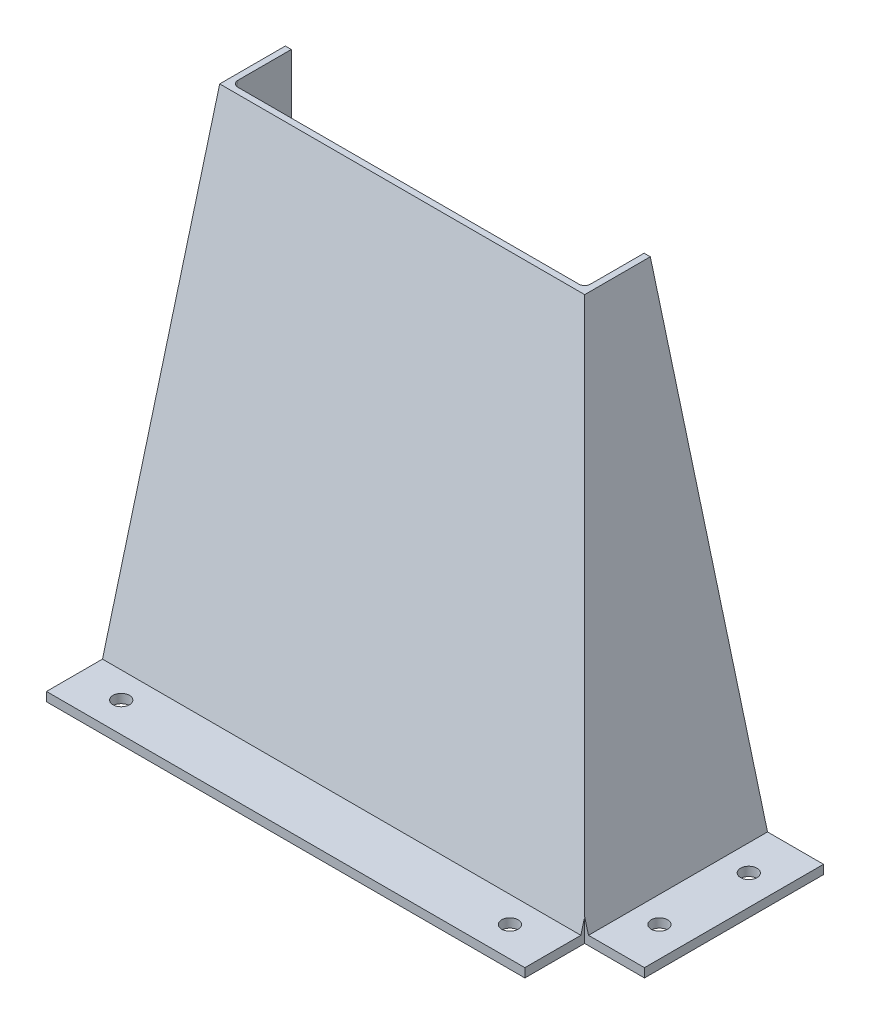
ISO-10303-21;
HEADER;
FILE_DESCRIPTION(('STEP AP214'),'2;1');
FILE_NAME('part.step','',(''),(''),'','','');
FILE_SCHEMA(('AUTOMOTIVE_DESIGN { 1 0 10303 214 1 1 1 1 }'));
ENDSEC;
DATA;
#1=APPLICATION_CONTEXT('core data for automotive mechanical design processes');
#2=APPLICATION_PROTOCOL_DEFINITION('international standard','automotive_design',2000,#1);
#3=PRODUCT_CONTEXT('',#1,'mechanical');
#4=PRODUCT('Part','Part','',(#3));
#5=PRODUCT_RELATED_PRODUCT_CATEGORY('part','',(#4));
#6=PRODUCT_DEFINITION_FORMATION('','',#4);
#7=PRODUCT_DEFINITION_CONTEXT('part definition',#1,'design');
#8=PRODUCT_DEFINITION('design','',#6,#7);
#9=PRODUCT_DEFINITION_SHAPE('','',#8);
#10=(LENGTH_UNIT() NAMED_UNIT(*) SI_UNIT(.MILLI.,.METRE.));
#11=(NAMED_UNIT(*) PLANE_ANGLE_UNIT() SI_UNIT($,.RADIAN.));
#12=(NAMED_UNIT(*) SI_UNIT($,.STERADIAN.) SOLID_ANGLE_UNIT());
#13=UNCERTAINTY_MEASURE_WITH_UNIT(LENGTH_MEASURE(1.E-05),#10,'distance_accuracy_value','');
#14=(GEOMETRIC_REPRESENTATION_CONTEXT(3) GLOBAL_UNCERTAINTY_ASSIGNED_CONTEXT((#13)) GLOBAL_UNIT_ASSIGNED_CONTEXT((#10,
#11,#12)) REPRESENTATION_CONTEXT('',''));
#15=CARTESIAN_POINT('',(0.,0.,0.));
#16=DIRECTION('',(0.,0.,1.));
#17=DIRECTION('',(1.,0.,0.));
#18=AXIS2_PLACEMENT_3D('',#15,#16,#17);
#19=CARTESIAN_POINT('',(0.,0.,0.));
#20=DIRECTION('',(0.,1.,0.));
#21=DIRECTION('',(0.,0.,1.));
#22=AXIS2_PLACEMENT_3D('',#19,#20,#21);
#23=PLANE('',#22);
#24=CARTESIAN_POINT('',(87.9651100404987,0.,-15.975));
#25=DIRECTION('',(0.,-1.,0.));
#26=DIRECTION('',(0.,0.,-1.));
#27=AXIS2_PLACEMENT_3D('',#24,#25,#26);
#28=CIRCLE('',#27,2.75000000000001);
#29=CARTESIAN_POINT('',(87.9651100404987,0.,-18.725));
#30=VERTEX_POINT('',#29);
#31=EDGE_CURVE('E216',#30,#30,#28,.T.);
#32=ORIENTED_EDGE('',*,*,#31,.F.);
#33=EDGE_LOOP('',(#32));
#34=FACE_BOUND('',#33,.T.);
#35=CARTESIAN_POINT('',(87.9651100404987,0.,13.9051100404987));
#36=DIRECTION('',(0.,-1.,0.));
#37=DIRECTION('',(0.,0.,-1.));
#38=AXIS2_PLACEMENT_3D('',#35,#36,#37);
#39=CIRCLE('',#38,2.75000000000001);
#40=CARTESIAN_POINT('',(87.9651100404987,0.,11.1551100404986));
#41=VERTEX_POINT('',#40);
#42=EDGE_CURVE('E398',#41,#41,#39,.T.);
#43=ORIENTED_EDGE('',*,*,#42,.F.);
#44=EDGE_LOOP('',(#43));
#45=FACE_BOUND('',#44,.T.);
#46=CARTESIAN_POINT('',(62.9651100404987,0.,38.9051100404986));
#47=DIRECTION('',(0.,-1.,0.));
#48=DIRECTION('',(0.,0.,-1.));
#49=AXIS2_PLACEMENT_3D('',#46,#47,#48);
#50=CIRCLE('',#49,2.75000000000001);
#51=CARTESIAN_POINT('',(62.9651100404987,0.,36.1551100404986));
#52=VERTEX_POINT('',#51);
#53=EDGE_CURVE('E402',#52,#52,#50,.T.);
#54=ORIENTED_EDGE('',*,*,#53,.F.);
#55=EDGE_LOOP('',(#54));
#56=FACE_BOUND('',#55,.T.);
#57=CARTESIAN_POINT('',(-67.035,0.,38.9051100404986));
#58=DIRECTION('',(0.,-1.,0.));
#59=DIRECTION('',(0.,0.,-1.));
#60=AXIS2_PLACEMENT_3D('',#57,#58,#59);
#61=CIRCLE('',#60,2.75000000000001);
#62=CARTESIAN_POINT('',(-67.035,0.,36.1551100404986));
#63=VERTEX_POINT('',#62);
#64=EDGE_CURVE('E405',#63,#63,#61,.T.);
#65=ORIENTED_EDGE('',*,*,#64,.F.);
#66=EDGE_LOOP('',(#65));
#67=FACE_BOUND('',#66,.T.);
#68=DIRECTION('',(0.,0.,1.));
#69=VECTOR('',#68,1.);
#70=CARTESIAN_POINT('',(-80.035,0.,28.9051100404986));
#71=LINE('',#70,#69);
#72=CARTESIAN_POINT('',(-80.035,0.,-30.975));
#73=VERTEX_POINT('',#72);
#74=CARTESIAN_POINT('',(-80.035,0.,26.8352200809973));
#75=VERTEX_POINT('',#74);
#76=EDGE_CURVE('E193',#73,#75,#71,.T.);
#77=ORIENTED_EDGE('',*,*,#76,.T.);
#78=CARTESIAN_POINT('',(-78.035,0.,26.8352200809973));
#79=DIRECTION('',(0.,1.,0.));
#80=DIRECTION('',(0.,0.,-1.));
#81=AXIS2_PLACEMENT_3D('',#78,#79,#80);
#82=ELLIPSE('',#81,2.06988995950134,2.);
#83=CARTESIAN_POINT('',(-78.035,0.,28.9051100404986));
#84=VERTEX_POINT('',#83);
#85=EDGE_CURVE('E14',#75,#84,#82,.T.);
#86=ORIENTED_EDGE('',*,*,#85,.T.);
#87=DIRECTION('',(1.,0.,0.));
#88=VECTOR('',#87,1.);
#89=CARTESIAN_POINT('',(0.,0.,28.9051100404986));
#90=LINE('',#89,#88);
#91=CARTESIAN_POINT('',(76.0326401612962,0.,28.9051100404986));
#92=VERTEX_POINT('',#91);
#93=EDGE_CURVE('E230',#84,#92,#90,.T.);
#94=ORIENTED_EDGE('',*,*,#93,.T.);
#95=CARTESIAN_POINT('',(75.8952200809973,0.,26.8352200809973));
#96=DIRECTION('',(0.,1.,0.));
#97=DIRECTION('',(-0.707106781186548,0.,-0.707106781186548));
#98=AXIS2_PLACEMENT_3D('',#95,#96,#97);
#99=ELLIPSE('',#98,2.13749593891752,2.);
#100=CARTESIAN_POINT('',(77.9651100404987,0.,26.9726401612961));
#101=VERTEX_POINT('',#100);
#102=EDGE_CURVE('E223',#92,#101,#99,.T.);
#103=ORIENTED_EDGE('',*,*,#102,.T.);
#104=DIRECTION('',(0.,0.,-1.));
#105=VECTOR('',#104,1.);
#106=CARTESIAN_POINT('',(77.9651100404987,0.,0.));
#107=LINE('',#106,#105);
#108=CARTESIAN_POINT('',(77.9651100404987,0.,-30.975));
#109=VERTEX_POINT('',#108);
#110=EDGE_CURVE('E71',#101,#109,#107,.T.);
#111=ORIENTED_EDGE('',*,*,#110,.T.);
#112=DIRECTION('',(-1.,0.,0.));
#113=VECTOR('',#112,1.);
#114=CARTESIAN_POINT('',(-80.035,0.,-30.975));
#115=LINE('',#114,#113);
#116=CARTESIAN_POINT('',(97.9651100404987,0.,-30.975));
#117=VERTEX_POINT('',#116);
#118=EDGE_CURVE('E267',#117,#109,#115,.T.);
#119=ORIENTED_EDGE('',*,*,#118,.F.);
#120=DIRECTION('',(0.,0.,-1.));
#121=VECTOR('',#120,1.);
#122=CARTESIAN_POINT('',(97.9651100404987,0.,69.1288584566553));
#123=LINE('',#122,#121);
#124=CARTESIAN_POINT('',(97.9651100404987,0.,28.9051100404986));
#125=VERTEX_POINT('',#124);
#126=EDGE_CURVE('E564',#125,#117,#123,.T.);
#127=ORIENTED_EDGE('',*,*,#126,.F.);
#128=DIRECTION('',(1.,0.,0.));
#129=VECTOR('',#128,1.);
#130=CARTESIAN_POINT('',(97.9651100404987,0.,28.9051100404987));
#131=LINE('',#130,#129);
#132=CARTESIAN_POINT('',(77.9651100404987,0.,28.9051100404986));
#133=VERTEX_POINT('',#132);
#134=EDGE_CURVE('E548',#133,#125,#131,.T.);
#135=ORIENTED_EDGE('',*,*,#134,.F.);
#136=DIRECTION('',(0.,0.,-1.));
#137=VECTOR('',#136,1.);
#138=CARTESIAN_POINT('',(77.9651100404987,0.,48.9051100404986));
#139=LINE('',#138,#137);
#140=CARTESIAN_POINT('',(77.9651100404987,0.,48.9051100404986));
#141=VERTEX_POINT('',#140);
#142=EDGE_CURVE('E545',#141,#133,#139,.T.);
#143=ORIENTED_EDGE('',*,*,#142,.F.);
#144=DIRECTION('',(-1.,0.,0.));
#145=VECTOR('',#144,1.);
#146=CARTESIAN_POINT('',(100.212107655599,0.,48.9051100404986));
#147=LINE('',#146,#145);
#148=CARTESIAN_POINT('',(-82.035,0.,48.9051100404986));
#149=VERTEX_POINT('',#148);
#150=EDGE_CURVE('E179',#141,#149,#147,.T.);
#151=ORIENTED_EDGE('',*,*,#150,.T.);
#152=DIRECTION('',(0.,0.,1.));
#153=VECTOR('',#152,1.);
#154=CARTESIAN_POINT('',(-82.035,0.,28.9051100404986));
#155=LINE('',#154,#153);
#156=CARTESIAN_POINT('',(-82.035,0.,-30.975));
#157=VERTEX_POINT('',#156);
#158=EDGE_CURVE('E192',#157,#149,#155,.T.);
#159=ORIENTED_EDGE('',*,*,#158,.F.);
#160=DIRECTION('',(1.,0.,0.));
#161=VECTOR('',#160,1.);
#162=CARTESIAN_POINT('',(-82.035,0.,-30.975));
#163=LINE('',#162,#161);
#164=EDGE_CURVE('E208',#157,#73,#163,.T.);
#165=ORIENTED_EDGE('',*,*,#164,.T.);
#166=EDGE_LOOP('',(#77,#86,#94,#103,#111,#119,#127,#135,#143,#151,#159,#165));
#167=FACE_BOUND('',#166,.T.);
#168=ADVANCED_FACE('F56',(#34,#45,#56,#67,#167),#23,.F.);
#169=CARTESIAN_POINT('',(100.212107655599,3.,28.9051100404986));
#170=DIRECTION('',(0.,1.,0.));
#171=DIRECTION('',(0.,0.,1.));
#172=AXIS2_PLACEMENT_3D('',#169,#170,#171);
#173=PLANE('',#172);
#174=CARTESIAN_POINT('',(62.9651100404987,3.,38.9051100404986));
#175=DIRECTION('',(0.,1.,0.));
#176=DIRECTION('',(0.,0.,1.));
#177=AXIS2_PLACEMENT_3D('',#174,#175,#176);
#178=CIRCLE('',#177,2.75000000000001);
#179=CARTESIAN_POINT('',(62.9651100404987,3.,41.6551100404987));
#180=VERTEX_POINT('',#179);
#181=EDGE_CURVE('E407',#180,#180,#178,.F.);
#182=ORIENTED_EDGE('',*,*,#181,.T.);
#183=EDGE_LOOP('',(#182));
#184=FACE_BOUND('',#183,.T.);
#185=CARTESIAN_POINT('',(-67.035,3.,38.9051100404986));
#186=DIRECTION('',(0.,1.,0.));
#187=DIRECTION('',(0.,0.,1.));
#188=AXIS2_PLACEMENT_3D('',#185,#186,#187);
#189=CIRCLE('',#188,2.75000000000001);
#190=CARTESIAN_POINT('',(-67.035,3.,41.6551100404987));
#191=VERTEX_POINT('',#190);
#192=EDGE_CURVE('E199',#191,#191,#189,.F.);
#193=ORIENTED_EDGE('',*,*,#192,.T.);
#194=EDGE_LOOP('',(#193));
#195=FACE_BOUND('',#194,.T.);
#196=DIRECTION('',(0.,0.,-1.));
#197=VECTOR('',#196,1.);
#198=CARTESIAN_POINT('',(77.9651100404987,3.,48.9051100404986));
#199=LINE('',#198,#197);
#200=CARTESIAN_POINT('',(77.9651100404987,3.,48.9051100404986));
#201=VERTEX_POINT('',#200);
#202=CARTESIAN_POINT('',(77.9651100404987,3.,30.175));
#203=VERTEX_POINT('',#202);
#204=EDGE_CURVE('E276',#201,#203,#199,.T.);
#205=ORIENTED_EDGE('',*,*,#204,.T.);
#206=DIRECTION('',(1.,0.,0.));
#207=VECTOR('',#206,1.);
#208=CARTESIAN_POINT('',(0.,3.,30.175));
#209=LINE('',#208,#207);
#210=CARTESIAN_POINT('',(-82.035,3.,30.175));
#211=VERTEX_POINT('',#210);
#212=EDGE_CURVE('E178',#211,#203,#209,.T.);
#213=ORIENTED_EDGE('',*,*,#212,.F.);
#214=DIRECTION('',(0.,0.,-1.));
#215=VECTOR('',#214,1.);
#216=CARTESIAN_POINT('',(-82.035,3.,48.9051100404986));
#217=LINE('',#216,#215);
#218=CARTESIAN_POINT('',(-82.035,3.,48.9051100404986));
#219=VERTEX_POINT('',#218);
#220=EDGE_CURVE('E182',#219,#211,#217,.T.);
#221=ORIENTED_EDGE('',*,*,#220,.F.);
#222=DIRECTION('',(-1.,0.,0.));
#223=VECTOR('',#222,1.);
#224=CARTESIAN_POINT('',(100.212107655599,3.,48.9051100404986));
#225=LINE('',#224,#223);
#226=EDGE_CURVE('E169',#201,#219,#225,.T.);
#227=ORIENTED_EDGE('',*,*,#226,.F.);
#228=EDGE_LOOP('',(#205,#213,#221,#227));
#229=FACE_BOUND('',#228,.T.);
#230=ADVANCED_FACE('F183',(#184,#195,#229),#173,.T.);
#231=CARTESIAN_POINT('',(0.,150.,0.));
#232=DIRECTION('',(0.,-1.,0.));
#233=DIRECTION('',(0.,0.,-1.));
#234=AXIS2_PLACEMENT_3D('',#231,#232,#233);
#235=PLANE('',#234);
#236=DIRECTION('',(1.,0.,0.));
#237=VECTOR('',#236,1.);
#238=CARTESIAN_POINT('',(0.,150.,-11.0948899595014));
#239=LINE('',#238,#237);
#240=CARTESIAN_POINT('',(-78.035,150.,-11.0948899595014));
#241=VERTEX_POINT('',#240);
#242=CARTESIAN_POINT('',(36.0326401612962,150.,-11.0948899595014));
#243=VERTEX_POINT('',#242);
#244=EDGE_CURVE('E250',#241,#243,#239,.T.);
#245=ORIENTED_EDGE('',*,*,#244,.F.);
#246=CARTESIAN_POINT('',(-78.035,150.,-13.1647799190027));
#247=DIRECTION('',(0.,-1.,0.));
#248=DIRECTION('',(0.,0.,-1.));
#249=AXIS2_PLACEMENT_3D('',#246,#247,#248);
#250=ELLIPSE('',#249,2.06988995950134,2.);
#251=CARTESIAN_POINT('',(-80.035,150.,-13.1647799190027));
#252=VERTEX_POINT('',#251);
#253=EDGE_CURVE('E64',#241,#252,#250,.T.);
#254=ORIENTED_EDGE('',*,*,#253,.T.);
#255=DIRECTION('',(0.,0.,-1.));
#256=VECTOR('',#255,1.);
#257=CARTESIAN_POINT('',(-80.035,150.,-30.975));
#258=LINE('',#257,#256);
#259=CARTESIAN_POINT('',(-80.035,150.,-30.975));
#260=VERTEX_POINT('',#259);
#261=EDGE_CURVE('E213',#252,#260,#258,.T.);
#262=ORIENTED_EDGE('',*,*,#261,.T.);
#263=DIRECTION('',(1.,0.,0.));
#264=VECTOR('',#263,1.);
#265=CARTESIAN_POINT('',(-82.035,150.,-30.975));
#266=LINE('',#265,#264);
#267=CARTESIAN_POINT('',(-82.035,150.,-30.975));
#268=VERTEX_POINT('',#267);
#269=EDGE_CURVE('E277',#268,#260,#266,.T.);
#270=ORIENTED_EDGE('',*,*,#269,.F.);
#271=DIRECTION('',(0.,0.,-1.));
#272=VECTOR('',#271,1.);
#273=CARTESIAN_POINT('',(-82.035,150.,-9.02500000000001));
#274=LINE('',#273,#272);
#275=CARTESIAN_POINT('',(-82.035,150.,-9.02500000000001));
#276=VERTEX_POINT('',#275);
#277=EDGE_CURVE('E203',#276,#268,#274,.T.);
#278=ORIENTED_EDGE('',*,*,#277,.F.);
#279=DIRECTION('',(1.,0.,0.));
#280=VECTOR('',#279,1.);
#281=CARTESIAN_POINT('',(-82.035,150.,-9.02500000000001));
#282=LINE('',#281,#280);
#283=CARTESIAN_POINT('',(-80.035,150.,-9.02500000000001));
#284=VERTEX_POINT('',#283);
#285=EDGE_CURVE('E274',#276,#284,#282,.T.);
#286=ORIENTED_EDGE('',*,*,#285,.T.);
#287=DIRECTION('',(1.,0.,0.));
#288=VECTOR('',#287,1.);
#289=CARTESIAN_POINT('',(-80.035,150.,-9.02500000000001));
#290=LINE('',#289,#288);
#291=CARTESIAN_POINT('',(40.035,150.,-9.02500000000001));
#292=VERTEX_POINT('',#291);
#293=EDGE_CURVE('E263',#284,#292,#290,.T.);
#294=ORIENTED_EDGE('',*,*,#293,.T.);
#295=DIRECTION('',(0.,0.,1.));
#296=VECTOR('',#295,1.);
#297=CARTESIAN_POINT('',(40.035,150.,-30.975));
#298=LINE('',#297,#296);
#299=CARTESIAN_POINT('',(40.035,150.,-30.975));
#300=VERTEX_POINT('',#299);
#301=EDGE_CURVE('E241',#300,#292,#298,.T.);
#302=ORIENTED_EDGE('',*,*,#301,.F.);
#303=DIRECTION('',(1.,0.,0.));
#304=VECTOR('',#303,1.);
#305=CARTESIAN_POINT('',(-80.035,150.,-30.975));
#306=LINE('',#305,#304);
#307=CARTESIAN_POINT('',(37.9651100404987,150.,-30.975));
#308=VERTEX_POINT('',#307);
#309=EDGE_CURVE('E237',#308,#300,#306,.T.);
#310=ORIENTED_EDGE('',*,*,#309,.F.);
#311=DIRECTION('',(0.,0.,1.));
#312=VECTOR('',#311,1.);
#313=CARTESIAN_POINT('',(37.9651100404987,150.,0.));
#314=LINE('',#313,#312);
#315=CARTESIAN_POINT('',(37.9651100404987,150.,-13.0273598387038));
#316=VERTEX_POINT('',#315);
#317=EDGE_CURVE('E270',#308,#316,#314,.T.);
#318=ORIENTED_EDGE('',*,*,#317,.T.);
#319=CARTESIAN_POINT('',(35.8952200809973,150.,-13.1647799190027));
#320=DIRECTION('',(0.,-1.,0.));
#321=DIRECTION('',(-0.707106781186548,0.,-0.707106781186548));
#322=AXIS2_PLACEMENT_3D('',#319,#320,#321);
#323=ELLIPSE('',#322,2.13749593891752,2.);
#324=EDGE_CURVE('E221',#316,#243,#323,.T.);
#325=ORIENTED_EDGE('',*,*,#324,.T.);
#326=EDGE_LOOP('',(#245,#254,#262,#270,#278,#286,#294,#302,#310,#318,#325));
#327=FACE_BOUND('',#326,.T.);
#328=ADVANCED_FACE('F291',(#327),#235,.F.);
#329=CARTESIAN_POINT('',(0.,0.,-30.975));
#330=DIRECTION('',(0.,0.,-1.));
#331=DIRECTION('',(-1.,0.,0.));
#332=AXIS2_PLACEMENT_3D('',#329,#330,#331);
#333=PLANE('',#332);
#334=DIRECTION('',(-0.257662650560332,0.966234939601246,0.));
#335=VECTOR('',#334,1.);
#336=CARTESIAN_POINT('',(80.035,0.,-30.975));
#337=LINE('',#336,#335);
#338=CARTESIAN_POINT('',(79.235,3.,-30.975));
#339=VERTEX_POINT('',#338);
#340=EDGE_CURVE('E261',#339,#300,#337,.T.);
#341=ORIENTED_EDGE('',*,*,#340,.F.);
#342=DIRECTION('',(1.,0.,0.));
#343=VECTOR('',#342,1.);
#344=CARTESIAN_POINT('',(77.9651100404987,3.,-30.975));
#345=LINE('',#344,#343);
#346=CARTESIAN_POINT('',(97.9651100404987,3.,-30.975));
#347=VERTEX_POINT('',#346);
#348=EDGE_CURVE('E558',#339,#347,#345,.T.);
#349=ORIENTED_EDGE('',*,*,#348,.T.);
#350=DIRECTION('',(0.,-1.,0.));
#351=VECTOR('',#350,1.);
#352=CARTESIAN_POINT('',(97.9651100404987,0.,-30.975));
#353=LINE('',#352,#351);
#354=EDGE_CURVE('E559',#347,#117,#353,.T.);
#355=ORIENTED_EDGE('',*,*,#354,.T.);
#356=ORIENTED_EDGE('',*,*,#118,.T.);
#357=DIRECTION('',(-0.257662650560332,0.966234939601246,0.));
#358=VECTOR('',#357,1.);
#359=CARTESIAN_POINT('',(72.7890031498432,19.4104008399582,-30.975));
#360=LINE('',#359,#358);
#361=EDGE_CURVE('E249',#109,#308,#360,.T.);
#362=ORIENTED_EDGE('',*,*,#361,.T.);
#363=ORIENTED_EDGE('',*,*,#309,.T.);
#364=EDGE_LOOP('',(#341,#349,#355,#356,#362,#363));
#365=FACE_BOUND('',#364,.T.);
#366=ADVANCED_FACE('F300',(#365),#333,.T.);
#367=CARTESIAN_POINT('',(0.,7.71161825726141,28.9185684647303));
#368=DIRECTION('',(0.,-0.257662650560332,-0.966234939601246));
#369=DIRECTION('',(0.,0.966234939601246,-0.257662650560332));
#370=AXIS2_PLACEMENT_3D('',#367,#368,#369);
#371=PLANE('',#370);
#372=ORIENTED_EDGE('',*,*,#212,.T.);
#373=DIRECTION('',(0.,-0.966234939601246,0.257662650560332));
#374=VECTOR('',#373,1.);
#375=CARTESIAN_POINT('',(77.9651100404987,135.578592935976,-5.1792914495935));
#376=LINE('',#375,#374);
#377=CARTESIAN_POINT('',(77.9651100404987,7.76208734813003,28.9051100404987));
#378=VERTEX_POINT('',#377);
#379=EDGE_CURVE('E553',#378,#203,#376,.T.);
#380=ORIENTED_EDGE('',*,*,#379,.F.);
#381=DIRECTION('',(-0.249513144620722,0.935674292327708,-0.249513144620722));
#382=VECTOR('',#381,1.);
#383=CARTESIAN_POINT('',(80.035,0.,30.975));
#384=LINE('',#383,#382);
#385=EDGE_CURVE('E264',#378,#292,#384,.T.);
#386=ORIENTED_EDGE('',*,*,#385,.T.);
#387=ORIENTED_EDGE('',*,*,#293,.F.);
#388=ORIENTED_EDGE('',*,*,#285,.F.);
#389=DIRECTION('',(0.,0.966234939601246,-0.257662650560332));
#390=VECTOR('',#389,1.);
#391=CARTESIAN_POINT('',(-82.035,3.,30.175));
#392=LINE('',#391,#390);
#393=EDGE_CURVE('E187',#211,#276,#392,.T.);
#394=ORIENTED_EDGE('',*,*,#393,.F.);
#395=EDGE_LOOP('',(#372,#380,#386,#387,#388,#394));
#396=FACE_BOUND('',#395,.T.);
#397=ADVANCED_FACE('F326',(#396),#371,.F.);
#398=CARTESIAN_POINT('',(74.7214730290457,19.9257261410788,0.));
#399=DIRECTION('',(0.966234939601246,0.257662650560332,0.));
#400=DIRECTION('',(-0.257662650560332,0.966234939601246,0.));
#401=AXIS2_PLACEMENT_3D('',#398,#399,#400);
#402=PLANE('',#401);
#403=DIRECTION('',(0.257662650560332,-0.966234939601246,0.));
#404=VECTOR('',#403,1.);
#405=CARTESIAN_POINT('',(43.8807085504065,135.578592935976,28.9051100404986));
#406=LINE('',#405,#404);
#407=CARTESIAN_POINT('',(79.235,3.,28.9051100404987));
#408=VERTEX_POINT('',#407);
#409=EDGE_CURVE('E542',#378,#408,#406,.T.);
#410=ORIENTED_EDGE('',*,*,#409,.T.);
#411=DIRECTION('',(0.,0.,1.));
#412=VECTOR('',#411,1.);
#413=CARTESIAN_POINT('',(79.235,3.,0.));
#414=LINE('',#413,#412);
#415=EDGE_CURVE('E566',#339,#408,#414,.T.);
#416=ORIENTED_EDGE('',*,*,#415,.F.);
#417=ORIENTED_EDGE('',*,*,#340,.T.);
#418=ORIENTED_EDGE('',*,*,#301,.T.);
#419=ORIENTED_EDGE('',*,*,#385,.F.);
#420=EDGE_LOOP('',(#410,#416,#417,#418,#419));
#421=FACE_BOUND('',#420,.T.);
#422=ADVANCED_FACE('F343',(#421),#402,.T.);
#423=CARTESIAN_POINT('',(0.,7.19629295614074,26.9860985855278));
#424=DIRECTION('',(0.,-0.257662650560332,-0.966234939601246));
#425=DIRECTION('',(0.,0.966234939601246,-0.257662650560332));
#426=AXIS2_PLACEMENT_3D('',#423,#424,#425);
#427=PLANE('',#426);
#428=ORIENTED_EDGE('',*,*,#244,.T.);
#429=DIRECTION('',(-0.249513144620722,0.935674292327708,-0.249513144620722));
#430=VECTOR('',#429,1.);
#431=CARTESIAN_POINT('',(69.4995506545697,24.4990856502245,22.3720205337721));
#432=LINE('',#431,#430);
#433=EDGE_CURVE('E217',#243,#92,#432,.F.);
#434=ORIENTED_EDGE('',*,*,#433,.T.);
#435=ORIENTED_EDGE('',*,*,#93,.F.);
#436=DIRECTION('',(0.,0.966234939601246,-0.257662650560332));
#437=VECTOR('',#436,1.);
#438=CARTESIAN_POINT('',(-78.035,7.19629295614074,26.9860985855278));
#439=LINE('',#438,#437);
#440=EDGE_CURVE('E236',#84,#241,#439,.T.);
#441=ORIENTED_EDGE('',*,*,#440,.T.);
#442=EDGE_LOOP('',(#428,#434,#435,#441));
#443=FACE_BOUND('',#442,.T.);
#444=ADVANCED_FACE('F347',(#443),#427,.T.);
#445=CARTESIAN_POINT('',(72.7890031498432,19.4104008399582,0.));
#446=DIRECTION('',(0.966234939601246,0.257662650560332,0.));
#447=DIRECTION('',(-0.257662650560332,0.966234939601246,0.));
#448=AXIS2_PLACEMENT_3D('',#445,#446,#447);
#449=PLANE('',#448);
#450=ORIENTED_EDGE('',*,*,#110,.F.);
#451=DIRECTION('',(-0.249513144620722,0.935674292327708,-0.249513144620722));
#452=VECTOR('',#451,1.);
#453=CARTESIAN_POINT('',(71.4320205337721,24.4990856502245,20.4395506545696));
#454=LINE('',#453,#452);
#455=EDGE_CURVE('E233',#101,#316,#454,.T.);
#456=ORIENTED_EDGE('',*,*,#455,.T.);
#457=ORIENTED_EDGE('',*,*,#317,.F.);
#458=ORIENTED_EDGE('',*,*,#361,.F.);
#459=EDGE_LOOP('',(#450,#456,#457,#458));
#460=FACE_BOUND('',#459,.T.);
#461=ADVANCED_FACE('F375',(#460),#449,.F.);
#462=CARTESIAN_POINT('',(87.9651100404987,3.,-15.975));
#463=DIRECTION('',(0.,1.,0.));
#464=DIRECTION('',(0.,0.,1.));
#465=AXIS2_PLACEMENT_3D('',#462,#463,#464);
#466=CIRCLE('',#465,2.75000000000001);
#467=CARTESIAN_POINT('',(87.9651100404987,3.,-13.225));
#468=VERTEX_POINT('',#467);
#469=EDGE_CURVE('E417',#468,#468,#466,.F.);
#470=ORIENTED_EDGE('',*,*,#469,.T.);
#471=EDGE_LOOP('',(#470));
#472=FACE_BOUND('',#471,.T.);
#473=CARTESIAN_POINT('',(87.9651100404987,3.,13.9051100404987));
#474=DIRECTION('',(0.,1.,0.));
#475=DIRECTION('',(0.,0.,1.));
#476=AXIS2_PLACEMENT_3D('',#473,#474,#475);
#477=CIRCLE('',#476,2.75000000000001);
#478=CARTESIAN_POINT('',(87.9651100404987,3.,16.6551100404987));
#479=VERTEX_POINT('',#478);
#480=EDGE_CURVE('E413',#479,#479,#477,.F.);
#481=ORIENTED_EDGE('',*,*,#480,.T.);
#482=EDGE_LOOP('',(#481));
#483=FACE_BOUND('',#482,.T.);
#484=DIRECTION('',(1.,0.,0.));
#485=VECTOR('',#484,1.);
#486=CARTESIAN_POINT('',(97.9651100404987,3.,28.9051100404987));
#487=LINE('',#486,#485);
#488=CARTESIAN_POINT('',(97.9651100404987,3.,28.9051100404987));
#489=VERTEX_POINT('',#488);
#490=EDGE_CURVE('E539',#408,#489,#487,.T.);
#491=ORIENTED_EDGE('',*,*,#490,.T.);
#492=DIRECTION('',(0.,0.,-1.));
#493=VECTOR('',#492,1.);
#494=CARTESIAN_POINT('',(97.9651100404987,3.,69.1288584566553));
#495=LINE('',#494,#493);
#496=EDGE_CURVE('E561',#489,#347,#495,.T.);
#497=ORIENTED_EDGE('',*,*,#496,.T.);
#498=ORIENTED_EDGE('',*,*,#348,.F.);
#499=ORIENTED_EDGE('',*,*,#415,.T.);
#500=EDGE_LOOP('',(#491,#497,#498,#499));
#501=FACE_BOUND('',#500,.T.);
#502=ADVANCED_FACE('F377',(#472,#483,#501),#173,.T.);
#503=CARTESIAN_POINT('',(100.212107655599,0.,48.9051100404986));
#504=DIRECTION('',(0.,0.,1.));
#505=DIRECTION('',(1.,0.,0.));
#506=AXIS2_PLACEMENT_3D('',#503,#504,#505);
#507=PLANE('',#506);
#508=DIRECTION('',(0.,-1.,0.));
#509=VECTOR('',#508,1.);
#510=CARTESIAN_POINT('',(77.9651100404987,150.0011,48.9051100404986));
#511=LINE('',#510,#509);
#512=EDGE_CURVE('E175',#201,#141,#511,.T.);
#513=ORIENTED_EDGE('',*,*,#512,.F.);
#514=ORIENTED_EDGE('',*,*,#226,.T.);
#515=DIRECTION('',(0.,1.,0.));
#516=VECTOR('',#515,1.);
#517=CARTESIAN_POINT('',(-82.035,0.,48.9051100404986));
#518=LINE('',#517,#516);
#519=EDGE_CURVE('E174',#149,#219,#518,.T.);
#520=ORIENTED_EDGE('',*,*,#519,.F.);
#521=ORIENTED_EDGE('',*,*,#150,.F.);
#522=EDGE_LOOP('',(#513,#514,#520,#521));
#523=FACE_BOUND('',#522,.T.);
#524=ADVANCED_FACE('F171',(#523),#507,.T.);
#525=CARTESIAN_POINT('',(97.9651100404987,0.,69.1288584566553));
#526=DIRECTION('',(1.,0.,0.));
#527=DIRECTION('',(0.,0.,-1.));
#528=AXIS2_PLACEMENT_3D('',#525,#526,#527);
#529=PLANE('',#528);
#530=DIRECTION('',(0.,-1.,0.));
#531=VECTOR('',#530,1.);
#532=CARTESIAN_POINT('',(97.9651100404987,150.0011,28.9051100404987));
#533=LINE('',#532,#531);
#534=EDGE_CURVE('E550',#489,#125,#533,.T.);
#535=ORIENTED_EDGE('',*,*,#534,.T.);
#536=ORIENTED_EDGE('',*,*,#126,.T.);
#537=ORIENTED_EDGE('',*,*,#354,.F.);
#538=ORIENTED_EDGE('',*,*,#496,.F.);
#539=EDGE_LOOP('',(#535,#536,#537,#538));
#540=FACE_BOUND('',#539,.T.);
#541=ADVANCED_FACE('F458',(#540),#529,.T.);
#542=CARTESIAN_POINT('',(77.9651100404987,150.0011,48.9051100404986));
#543=DIRECTION('',(-1.,0.,0.));
#544=DIRECTION('',(0.,0.,1.));
#545=AXIS2_PLACEMENT_3D('',#542,#543,#544);
#546=PLANE('',#545);
#547=ORIENTED_EDGE('',*,*,#379,.T.);
#548=ORIENTED_EDGE('',*,*,#204,.F.);
#549=ORIENTED_EDGE('',*,*,#512,.T.);
#550=ORIENTED_EDGE('',*,*,#142,.T.);
#551=DIRECTION('',(0.,-1.,0.));
#552=VECTOR('',#551,1.);
#553=CARTESIAN_POINT('',(77.9651100404987,150.0011,28.9051100404986));
#554=LINE('',#553,#552);
#555=EDGE_CURVE('E554',#378,#133,#554,.T.);
#556=ORIENTED_EDGE('',*,*,#555,.F.);
#557=EDGE_LOOP('',(#547,#548,#549,#550,#556));
#558=FACE_BOUND('',#557,.T.);
#559=ADVANCED_FACE('F454',(#558),#546,.F.);
#560=CARTESIAN_POINT('',(97.9651100404987,150.0011,28.9051100404987));
#561=DIRECTION('',(0.,0.,-1.));
#562=DIRECTION('',(-1.,0.,0.));
#563=AXIS2_PLACEMENT_3D('',#560,#561,#562);
#564=PLANE('',#563);
#565=ORIENTED_EDGE('',*,*,#555,.T.);
#566=ORIENTED_EDGE('',*,*,#134,.T.);
#567=ORIENTED_EDGE('',*,*,#534,.F.);
#568=ORIENTED_EDGE('',*,*,#490,.F.);
#569=ORIENTED_EDGE('',*,*,#409,.F.);
#570=EDGE_LOOP('',(#565,#566,#567,#568,#569));
#571=FACE_BOUND('',#570,.T.);
#572=ADVANCED_FACE('F450',(#571),#564,.F.);
#573=CARTESIAN_POINT('',(-82.035,0.,-30.975));
#574=DIRECTION('',(0.,0.,1.));
#575=DIRECTION('',(1.,0.,0.));
#576=AXIS2_PLACEMENT_3D('',#573,#574,#575);
#577=PLANE('',#576);
#578=DIRECTION('',(0.,-1.,0.));
#579=VECTOR('',#578,1.);
#580=CARTESIAN_POINT('',(-80.035,0.,-30.975));
#581=LINE('',#580,#579);
#582=EDGE_CURVE('E196',#260,#73,#581,.T.);
#583=ORIENTED_EDGE('',*,*,#582,.T.);
#584=ORIENTED_EDGE('',*,*,#164,.F.);
#585=DIRECTION('',(0.,-1.,0.));
#586=VECTOR('',#585,1.);
#587=CARTESIAN_POINT('',(-82.035,0.,-30.975));
#588=LINE('',#587,#586);
#589=EDGE_CURVE('E205',#268,#157,#588,.T.);
#590=ORIENTED_EDGE('',*,*,#589,.F.);
#591=ORIENTED_EDGE('',*,*,#269,.T.);
#592=EDGE_LOOP('',(#583,#584,#590,#591));
#593=FACE_BOUND('',#592,.T.);
#594=ADVANCED_FACE('F444',(#593),#577,.F.);
#595=CARTESIAN_POINT('',(-82.035,0.,0.));
#596=DIRECTION('',(-1.,0.,0.));
#597=DIRECTION('',(0.,0.,1.));
#598=AXIS2_PLACEMENT_3D('',#595,#596,#597);
#599=PLANE('',#598);
#600=ORIENTED_EDGE('',*,*,#519,.T.);
#601=ORIENTED_EDGE('',*,*,#220,.T.);
#602=ORIENTED_EDGE('',*,*,#393,.T.);
#603=ORIENTED_EDGE('',*,*,#277,.T.);
#604=ORIENTED_EDGE('',*,*,#589,.T.);
#605=ORIENTED_EDGE('',*,*,#158,.T.);
#606=EDGE_LOOP('',(#600,#601,#602,#603,#604,#605));
#607=FACE_BOUND('',#606,.T.);
#608=ADVANCED_FACE('F190',(#607),#599,.T.);
#609=CARTESIAN_POINT('',(-80.035,0.,0.));
#610=DIRECTION('',(-1.,0.,0.));
#611=DIRECTION('',(0.,0.,1.));
#612=AXIS2_PLACEMENT_3D('',#609,#610,#611);
#613=PLANE('',#612);
#614=ORIENTED_EDGE('',*,*,#261,.F.);
#615=DIRECTION('',(0.,0.966234939601246,-0.257662650560332));
#616=VECTOR('',#615,1.);
#617=CARTESIAN_POINT('',(-80.035,6.68096765502008,25.0536287063253));
#618=LINE('',#617,#616);
#619=EDGE_CURVE('E219',#252,#75,#618,.F.);
#620=ORIENTED_EDGE('',*,*,#619,.T.);
#621=ORIENTED_EDGE('',*,*,#76,.F.);
#622=ORIENTED_EDGE('',*,*,#582,.F.);
#623=EDGE_LOOP('',(#614,#620,#621,#622));
#624=FACE_BOUND('',#623,.T.);
#625=ADVANCED_FACE('F443',(#624),#613,.F.);
#626=CARTESIAN_POINT('',(69.4995506545697,23.9837603491038,20.4395506545696));
#627=DIRECTION('',(-0.249513144620722,0.935674292327708,-0.249513144620722));
#628=DIRECTION('',(0.,0.257662650560332,0.966234939601246));
#629=AXIS2_PLACEMENT_3D('',#626,#627,#628);
#630=CYLINDRICAL_SURFACE('',#629,2.);
#631=ORIENTED_EDGE('',*,*,#102,.F.);
#632=ORIENTED_EDGE('',*,*,#433,.F.);
#633=ORIENTED_EDGE('',*,*,#324,.F.);
#634=ORIENTED_EDGE('',*,*,#455,.F.);
#635=EDGE_LOOP('',(#631,#632,#633,#634));
#636=FACE_BOUND('',#635,.T.);
#637=ADVANCED_FACE('F234',(#636),#630,.F.);
#638=CARTESIAN_POINT('',(-78.035,6.68096765502008,25.0536287063253));
#639=DIRECTION('',(0.,0.966234939601246,-0.257662650560332));
#640=DIRECTION('',(0.,0.257662650560332,0.966234939601246));
#641=AXIS2_PLACEMENT_3D('',#638,#639,#640);
#642=CYLINDRICAL_SURFACE('',#641,2.);
#643=ORIENTED_EDGE('',*,*,#85,.F.);
#644=ORIENTED_EDGE('',*,*,#619,.F.);
#645=ORIENTED_EDGE('',*,*,#253,.F.);
#646=ORIENTED_EDGE('',*,*,#440,.F.);
#647=EDGE_LOOP('',(#643,#644,#645,#646));
#648=FACE_BOUND('',#647,.T.);
#649=ADVANCED_FACE('F58',(#648),#642,.F.);
#650=CARTESIAN_POINT('',(87.9651100404987,150.0011,13.9051100404987));
#651=DIRECTION('',(0.,-1.,0.));
#652=DIRECTION('',(0.,0.,-1.));
#653=AXIS2_PLACEMENT_3D('',#650,#651,#652);
#654=CYLINDRICAL_SURFACE('',#653,2.75000000000001);
#655=ORIENTED_EDGE('',*,*,#480,.F.);
#656=EDGE_LOOP('',(#655));
#657=FACE_BOUND('',#656,.T.);
#658=ORIENTED_EDGE('',*,*,#42,.T.);
#659=EDGE_LOOP('',(#658));
#660=FACE_BOUND('',#659,.T.);
#661=ADVANCED_FACE('F424',(#657,#660),#654,.F.);
#662=CARTESIAN_POINT('',(87.9651100404987,150.0011,-15.975));
#663=DIRECTION('',(0.,-1.,0.));
#664=DIRECTION('',(0.,0.,-1.));
#665=AXIS2_PLACEMENT_3D('',#662,#663,#664);
#666=CYLINDRICAL_SURFACE('',#665,2.75000000000001);
#667=ORIENTED_EDGE('',*,*,#469,.F.);
#668=EDGE_LOOP('',(#667));
#669=FACE_BOUND('',#668,.T.);
#670=ORIENTED_EDGE('',*,*,#31,.T.);
#671=EDGE_LOOP('',(#670));
#672=FACE_BOUND('',#671,.T.);
#673=ADVANCED_FACE('F421',(#669,#672),#666,.F.);
#674=CARTESIAN_POINT('',(-67.035,150.0011,38.9051100404986));
#675=DIRECTION('',(0.,-1.,0.));
#676=DIRECTION('',(0.,0.,-1.));
#677=AXIS2_PLACEMENT_3D('',#674,#675,#676);
#678=CYLINDRICAL_SURFACE('',#677,2.75000000000001);
#679=ORIENTED_EDGE('',*,*,#192,.F.);
#680=EDGE_LOOP('',(#679));
#681=FACE_BOUND('',#680,.T.);
#682=ORIENTED_EDGE('',*,*,#64,.T.);
#683=EDGE_LOOP('',(#682));
#684=FACE_BOUND('',#683,.T.);
#685=ADVANCED_FACE('F423',(#681,#684),#678,.F.);
#686=CARTESIAN_POINT('',(62.9651100404987,150.0011,38.9051100404986));
#687=DIRECTION('',(0.,-1.,0.));
#688=DIRECTION('',(0.,0.,-1.));
#689=AXIS2_PLACEMENT_3D('',#686,#687,#688);
#690=CYLINDRICAL_SURFACE('',#689,2.75000000000001);
#691=ORIENTED_EDGE('',*,*,#181,.F.);
#692=EDGE_LOOP('',(#691));
#693=FACE_BOUND('',#692,.T.);
#694=ORIENTED_EDGE('',*,*,#53,.T.);
#695=EDGE_LOOP('',(#694));
#696=FACE_BOUND('',#695,.T.);
#697=ADVANCED_FACE('F431',(#693,#696),#690,.F.);
#698=CLOSED_SHELL('',(#168,#230,#328,#366,#397,#422,#444,#461,#502,#524,#541,#559,#572,#594,
#608,#625,#637,#649,#661,#673,#685,#697));
#699=MANIFOLD_SOLID_BREP('B2',#698);
#700=ADVANCED_BREP_SHAPE_REPRESENTATION('',(#18,#699),#14);
#701=SHAPE_DEFINITION_REPRESENTATION(#9,#700);
ENDSEC;
END-ISO-10303-21;
